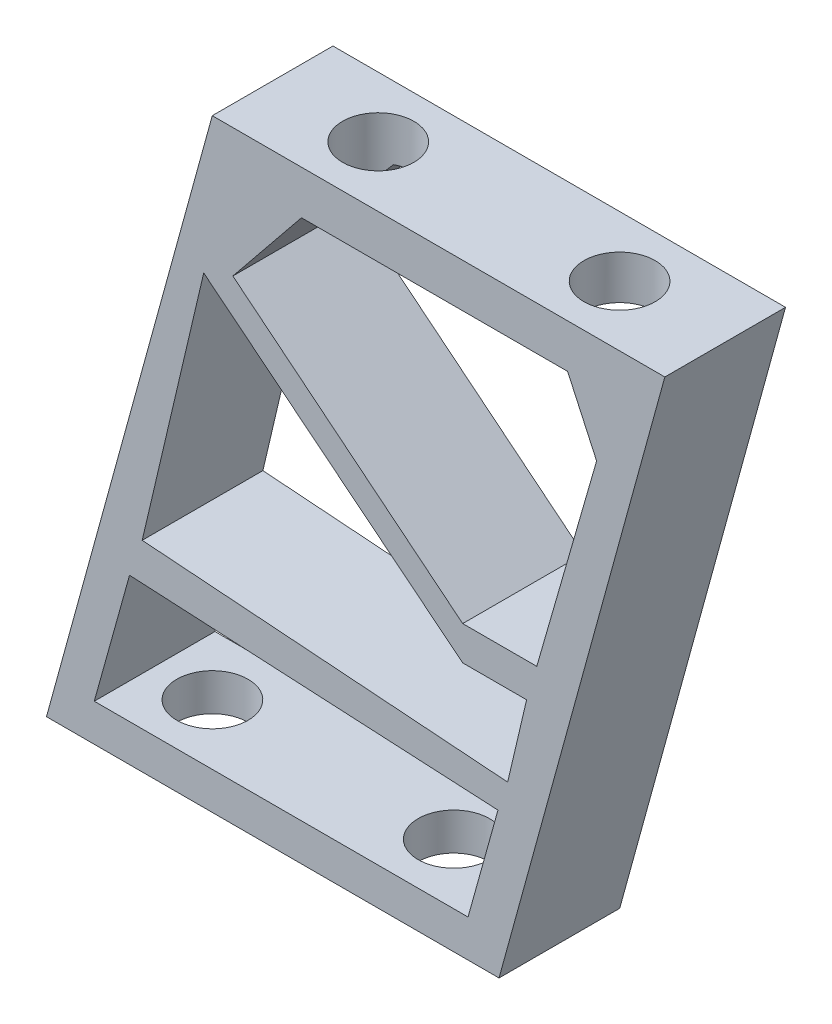
ISO-10303-21;
HEADER;
FILE_DESCRIPTION(('STEP AP214'),'2;1');
FILE_NAME('part.step','',(''),(''),'','','');
FILE_SCHEMA(('AUTOMOTIVE_DESIGN { 1 0 10303 214 1 1 1 1 }'));
ENDSEC;
DATA;
#1=APPLICATION_CONTEXT('core data for automotive mechanical design processes');
#2=APPLICATION_PROTOCOL_DEFINITION('international standard','automotive_design',2000,#1);
#3=PRODUCT_CONTEXT('',#1,'mechanical');
#4=PRODUCT('Part','Part','',(#3));
#5=PRODUCT_RELATED_PRODUCT_CATEGORY('part','',(#4));
#6=PRODUCT_DEFINITION_FORMATION('','',#4);
#7=PRODUCT_DEFINITION_CONTEXT('part definition',#1,'design');
#8=PRODUCT_DEFINITION('design','',#6,#7);
#9=PRODUCT_DEFINITION_SHAPE('','',#8);
#10=(LENGTH_UNIT() NAMED_UNIT(*) SI_UNIT(.MILLI.,.METRE.));
#11=(NAMED_UNIT(*) PLANE_ANGLE_UNIT() SI_UNIT($,.RADIAN.));
#12=(NAMED_UNIT(*) SI_UNIT($,.STERADIAN.) SOLID_ANGLE_UNIT());
#13=UNCERTAINTY_MEASURE_WITH_UNIT(LENGTH_MEASURE(1.E-05),#10,'distance_accuracy_value','');
#14=(GEOMETRIC_REPRESENTATION_CONTEXT(3) GLOBAL_UNCERTAINTY_ASSIGNED_CONTEXT((#13)) GLOBAL_UNIT_ASSIGNED_CONTEXT((#10,
#11,#12)) REPRESENTATION_CONTEXT('',''));
#15=CARTESIAN_POINT('',(0.,0.,0.));
#16=DIRECTION('',(0.,0.,1.));
#17=DIRECTION('',(1.,0.,0.));
#18=AXIS2_PLACEMENT_3D('',#15,#16,#17);
#19=CARTESIAN_POINT('',(-14.7335825545171,-18.5317133956386,5.08));
#20=DIRECTION('',(0.964262970192078,-0.264947021716328,0.));
#21=DIRECTION('',(0.264947021716328,0.964262970192078,0.));
#22=AXIS2_PLACEMENT_3D('',#19,#20,#21);
#23=PLANE('',#22);
#24=DIRECTION('',(-0.264947021716328,-0.964262970192078,0.));
#25=VECTOR('',#24,1.);
#26=CARTESIAN_POINT('',(-14.7335825545171,-18.5317133956386,0.));
#27=LINE('',#26,#25);
#28=CARTESIAN_POINT('',(-7.75451713395638,6.86828660436137,0.));
#29=VERTEX_POINT('',#28);
#30=CARTESIAN_POINT('',(-14.7335825545171,-18.5317133956386,0.));
#31=VERTEX_POINT('',#30);
#32=EDGE_CURVE('E327',#29,#31,#27,.T.);
#33=ORIENTED_EDGE('',*,*,#32,.T.);
#34=DIRECTION('',(0.,0.,-1.));
#35=VECTOR('',#34,1.);
#36=CARTESIAN_POINT('',(-14.7335825545171,-18.5317133956386,5.08));
#37=LINE('',#36,#35);
#38=CARTESIAN_POINT('',(-14.7335825545171,-18.5317133956386,5.08));
#39=VERTEX_POINT('',#38);
#40=EDGE_CURVE('E359',#39,#31,#37,.T.);
#41=ORIENTED_EDGE('',*,*,#40,.F.);
#42=DIRECTION('',(-0.264947021716328,-0.964262970192078,0.));
#43=VECTOR('',#42,1.);
#44=CARTESIAN_POINT('',(-14.7335825545171,-18.5317133956386,5.08));
#45=LINE('',#44,#43);
#46=CARTESIAN_POINT('',(-7.75451713395638,6.86828660436137,5.08));
#47=VERTEX_POINT('',#46);
#48=EDGE_CURVE('E333',#47,#39,#45,.T.);
#49=ORIENTED_EDGE('',*,*,#48,.F.);
#50=DIRECTION('',(0.,0.,-1.));
#51=VECTOR('',#50,1.);
#52=CARTESIAN_POINT('',(-7.75451713395638,6.86828660436137,5.08));
#53=LINE('',#52,#51);
#54=EDGE_CURVE('E343',#47,#29,#53,.T.);
#55=ORIENTED_EDGE('',*,*,#54,.T.);
#56=EDGE_LOOP('',(#33,#41,#49,#55));
#57=FACE_BOUND('',#56,.T.);
#58=ADVANCED_FACE('F38',(#57),#23,.F.);
#59=CARTESIAN_POINT('',(4.31641744548287,-18.5317133956386,5.08));
#60=DIRECTION('',(0.,1.,0.));
#61=DIRECTION('',(0.,0.,1.));
#62=AXIS2_PLACEMENT_3D('',#59,#60,#61);
#63=PLANE('',#62);
#64=CARTESIAN_POINT('',(-0.128582554517128,-18.5317133956386,2.54));
#65=DIRECTION('',(0.,-1.,0.));
#66=DIRECTION('',(0.,0.,-1.));
#67=AXIS2_PLACEMENT_3D('',#64,#65,#66);
#68=CIRCLE('',#67,1.5);
#69=CARTESIAN_POINT('',(-0.128582554517128,-18.5317133956386,1.04));
#70=VERTEX_POINT('',#69);
#71=EDGE_CURVE('E370',#70,#70,#68,.T.);
#72=ORIENTED_EDGE('',*,*,#71,.F.);
#73=EDGE_LOOP('',(#72));
#74=FACE_BOUND('',#73,.T.);
#75=CARTESIAN_POINT('',(-10.2885825545171,-18.5317133956386,2.54));
#76=DIRECTION('',(0.,-1.,0.));
#77=DIRECTION('',(0.,0.,-1.));
#78=AXIS2_PLACEMENT_3D('',#75,#76,#77);
#79=CIRCLE('',#78,1.5);
#80=CARTESIAN_POINT('',(-10.2885825545171,-18.5317133956386,1.04));
#81=VERTEX_POINT('',#80);
#82=EDGE_CURVE('E375',#81,#81,#79,.T.);
#83=ORIENTED_EDGE('',*,*,#82,.F.);
#84=EDGE_LOOP('',(#83));
#85=FACE_BOUND('',#84,.T.);
#86=DIRECTION('',(1.,0.,0.));
#87=VECTOR('',#86,1.);
#88=CARTESIAN_POINT('',(4.31641744548287,-18.5317133956386,0.));
#89=LINE('',#88,#87);
#90=CARTESIAN_POINT('',(4.31641744548287,-18.5317133956386,0.));
#91=VERTEX_POINT('',#90);
#92=EDGE_CURVE('E346',#31,#91,#89,.T.);
#93=ORIENTED_EDGE('',*,*,#92,.T.);
#94=DIRECTION('',(0.,0.,-1.));
#95=VECTOR('',#94,1.);
#96=CARTESIAN_POINT('',(4.31641744548287,-18.5317133956386,5.08));
#97=LINE('',#96,#95);
#98=CARTESIAN_POINT('',(4.31641744548287,-18.5317133956386,5.08));
#99=VERTEX_POINT('',#98);
#100=EDGE_CURVE('E356',#99,#91,#97,.T.);
#101=ORIENTED_EDGE('',*,*,#100,.F.);
#102=DIRECTION('',(1.,0.,0.));
#103=VECTOR('',#102,1.);
#104=CARTESIAN_POINT('',(4.31641744548287,-18.5317133956386,5.08));
#105=LINE('',#104,#103);
#106=EDGE_CURVE('E336',#39,#99,#105,.T.);
#107=ORIENTED_EDGE('',*,*,#106,.F.);
#108=ORIENTED_EDGE('',*,*,#40,.T.);
#109=EDGE_LOOP('',(#93,#101,#107,#108));
#110=FACE_BOUND('',#109,.T.);
#111=ADVANCED_FACE('F405',(#74,#85,#110),#63,.F.);
#112=CARTESIAN_POINT('',(11.2954828660436,6.86828660436136,5.08));
#113=DIRECTION('',(-0.964262970192078,0.264947021716328,0.));
#114=DIRECTION('',(-0.264947021716328,-0.964262970192078,0.));
#115=AXIS2_PLACEMENT_3D('',#112,#113,#114);
#116=PLANE('',#115);
#117=DIRECTION('',(0.264947021716328,0.964262970192078,0.));
#118=VECTOR('',#117,1.);
#119=CARTESIAN_POINT('',(11.2954828660436,6.86828660436136,0.));
#120=LINE('',#119,#118);
#121=CARTESIAN_POINT('',(11.2954828660436,6.86828660436136,0.));
#122=VERTEX_POINT('',#121);
#123=EDGE_CURVE('E348',#91,#122,#120,.T.);
#124=ORIENTED_EDGE('',*,*,#123,.T.);
#125=DIRECTION('',(0.,0.,-1.));
#126=VECTOR('',#125,1.);
#127=CARTESIAN_POINT('',(11.2954828660436,6.86828660436136,5.08));
#128=LINE('',#127,#126);
#129=CARTESIAN_POINT('',(11.2954828660436,6.86828660436136,5.08));
#130=VERTEX_POINT('',#129);
#131=EDGE_CURVE('E353',#130,#122,#128,.T.);
#132=ORIENTED_EDGE('',*,*,#131,.F.);
#133=DIRECTION('',(0.264947021716328,0.964262970192078,0.));
#134=VECTOR('',#133,1.);
#135=CARTESIAN_POINT('',(11.2954828660436,6.86828660436136,5.08));
#136=LINE('',#135,#134);
#137=EDGE_CURVE('E339',#99,#130,#136,.T.);
#138=ORIENTED_EDGE('',*,*,#137,.F.);
#139=ORIENTED_EDGE('',*,*,#100,.T.);
#140=EDGE_LOOP('',(#124,#132,#138,#139));
#141=FACE_BOUND('',#140,.T.);
#142=ADVANCED_FACE('F410',(#141),#116,.F.);
#143=CARTESIAN_POINT('',(-7.75451713395638,6.86828660436137,5.08));
#144=DIRECTION('',(0.,-1.,0.));
#145=DIRECTION('',(1.,0.,0.));
#146=AXIS2_PLACEMENT_3D('',#143,#144,#145);
#147=PLANE('',#146);
#148=CARTESIAN_POINT('',(6.85048286604362,6.86828660436137,2.54));
#149=DIRECTION('',(0.,1.,0.));
#150=DIRECTION('',(0.,0.,1.));
#151=AXIS2_PLACEMENT_3D('',#148,#149,#150);
#152=CIRCLE('',#151,1.5);
#153=CARTESIAN_POINT('',(6.85048286604362,6.86828660436137,4.04));
#154=VERTEX_POINT('',#153);
#155=EDGE_CURVE('E328',#154,#154,#152,.T.);
#156=ORIENTED_EDGE('',*,*,#155,.F.);
#157=EDGE_LOOP('',(#156));
#158=FACE_BOUND('',#157,.T.);
#159=CARTESIAN_POINT('',(-3.30951713395638,6.86828660436137,2.54));
#160=DIRECTION('',(0.,1.,0.));
#161=DIRECTION('',(0.,0.,1.));
#162=AXIS2_PLACEMENT_3D('',#159,#160,#161);
#163=CIRCLE('',#162,1.5);
#164=CARTESIAN_POINT('',(-3.30951713395638,6.86828660436137,4.04));
#165=VERTEX_POINT('',#164);
#166=EDGE_CURVE('E323',#165,#165,#163,.T.);
#167=ORIENTED_EDGE('',*,*,#166,.F.);
#168=EDGE_LOOP('',(#167));
#169=FACE_BOUND('',#168,.T.);
#170=DIRECTION('',(-1.,0.,0.));
#171=VECTOR('',#170,1.);
#172=CARTESIAN_POINT('',(-7.75451713395638,6.86828660436137,0.));
#173=LINE('',#172,#171);
#174=EDGE_CURVE('E337',#122,#29,#173,.T.);
#175=ORIENTED_EDGE('',*,*,#174,.T.);
#176=ORIENTED_EDGE('',*,*,#54,.F.);
#177=DIRECTION('',(-1.,0.,0.));
#178=VECTOR('',#177,1.);
#179=CARTESIAN_POINT('',(-7.75451713395638,6.86828660436137,5.08));
#180=LINE('',#179,#178);
#181=EDGE_CURVE('E341',#130,#47,#180,.T.);
#182=ORIENTED_EDGE('',*,*,#181,.F.);
#183=ORIENTED_EDGE('',*,*,#131,.T.);
#184=EDGE_LOOP('',(#175,#176,#182,#183));
#185=FACE_BOUND('',#184,.T.);
#186=ADVANCED_FACE('F393',(#158,#169,#185),#147,.F.);
#187=CARTESIAN_POINT('',(0.,0.,5.08));
#188=DIRECTION('',(0.,0.,-1.));
#189=DIRECTION('',(-1.,0.,0.));
#190=AXIS2_PLACEMENT_3D('',#187,#188,#189);
#191=PLANE('',#190);
#192=DIRECTION('',(0.268017444999017,0.96341405905052,0.));
#193=VECTOR('',#192,1.);
#194=CARTESIAN_POINT('',(-7.42840967186298,2.0665500590897,5.08));
#195=LINE('',#194,#193);
#196=CARTESIAN_POINT('',(-12.7218358869841,-16.9611712006699,5.08));
#197=VERTEX_POINT('',#196);
#198=CARTESIAN_POINT('',(-11.2373063223956,-11.6248892522841,5.08));
#199=VERTEX_POINT('',#198);
#200=EDGE_CURVE('E317',#197,#199,#195,.T.);
#201=ORIENTED_EDGE('',*,*,#200,.T.);
#202=DIRECTION('',(0.998640082945662,-0.0521342951835177,0.));
#203=VECTOR('',#202,1.);
#204=CARTESIAN_POINT('',(-0.635774049708128,-12.1783453195307,5.08));
#205=LINE('',#204,#203);
#206=CARTESIAN_POINT('',(4.27111704776784,-12.4345109925073,5.08));
#207=VERTEX_POINT('',#206);
#208=EDGE_CURVE('E320',#199,#207,#205,.T.);
#209=ORIENTED_EDGE('',*,*,#208,.T.);
#210=DIRECTION('',(-0.268017444999017,-0.96341405905052,0.));
#211=VECTOR('',#210,1.);
#212=CARTESIAN_POINT('',(7.17504554791132,-1.9960653028024,5.08));
#213=LINE('',#212,#211);
#214=CARTESIAN_POINT('',(3.01182059888051,-16.9611712006699,5.08));
#215=VERTEX_POINT('',#214);
#216=EDGE_CURVE('E311',#207,#215,#213,.T.);
#217=ORIENTED_EDGE('',*,*,#216,.T.);
#218=DIRECTION('',(-1.,0.,0.));
#219=VECTOR('',#218,1.);
#220=CARTESIAN_POINT('',(0.,-16.9611712006699,5.08));
#221=LINE('',#220,#219);
#222=EDGE_CURVE('E314',#215,#197,#221,.T.);
#223=ORIENTED_EDGE('',*,*,#222,.T.);
#224=EDGE_LOOP('',(#201,#209,#217,#223));
#225=FACE_BOUND('',#224,.T.);
#226=DIRECTION('',(0.228290771681176,0.973592996875601,0.));
#227=VECTOR('',#226,1.);
#228=CARTESIAN_POINT('',(-7.90466937511239,1.85350868106084,5.08));
#229=LINE('',#228,#227);
#230=CARTESIAN_POINT('',(-10.7043001822436,-10.0860932905282,5.08));
#231=VERTEX_POINT('',#230);
#232=CARTESIAN_POINT('',(-8.11511502540993,0.95601987832134,5.08));
#233=VERTEX_POINT('',#232);
#234=EDGE_CURVE('E305',#231,#233,#229,.T.);
#235=ORIENTED_EDGE('',*,*,#234,.T.);
#236=DIRECTION('',(0.779324811366926,-0.626620170747723,0.));
#237=VECTOR('',#236,1.);
#238=CARTESIAN_POINT('',(-2.71955958325272,-3.38230455730544,5.08));
#239=LINE('',#238,#237);
#240=CARTESIAN_POINT('',(2.78607256570793,-7.80913674195606,5.08));
#241=VERTEX_POINT('',#240);
#242=EDGE_CURVE('E308',#233,#241,#239,.T.);
#243=ORIENTED_EDGE('',*,*,#242,.T.);
#244=DIRECTION('',(1.,0.,0.));
#245=VECTOR('',#244,1.);
#246=CARTESIAN_POINT('',(0.,-7.80913674195606,5.08));
#247=LINE('',#246,#245);
#248=CARTESIAN_POINT('',(5.47680535621506,-7.80913674195606,5.08));
#249=VERTEX_POINT('',#248);
#250=EDGE_CURVE('E299',#241,#249,#247,.T.);
#251=ORIENTED_EDGE('',*,*,#250,.T.);
#252=DIRECTION('',(-0.228290771681176,-0.973592996875601,0.));
#253=VECTOR('',#252,1.);
#254=CARTESIAN_POINT('',(6.92704912998805,-1.62427358910065,5.08));
#255=LINE('',#254,#253);
#256=CARTESIAN_POINT('',(4.67953751767725,-11.2092495827791,5.08));
#257=VERTEX_POINT('',#256);
#258=EDGE_CURVE('E193',#249,#257,#255,.T.);
#259=ORIENTED_EDGE('',*,*,#258,.T.);
#260=DIRECTION('',(-0.997345461341722,0.0728150447439755,0.));
#261=VECTOR('',#260,1.);
#262=CARTESIAN_POINT('',(-0.789224318355459,-10.8099815726263,5.08));
#263=LINE('',#262,#261);
#264=EDGE_CURVE('E302',#257,#231,#263,.T.);
#265=ORIENTED_EDGE('',*,*,#264,.T.);
#266=EDGE_LOOP('',(#235,#243,#251,#259,#265));
#267=FACE_BOUND('',#266,.T.);
#268=DIRECTION('',(0.629179252222636,0.777260232208341,0.));
#269=VECTOR('',#268,1.);
#270=CARTESIAN_POINT('',(-4.87380278290498,3.94526242738069,5.08));
#271=LINE('',#270,#269);
#272=CARTESIAN_POINT('',(-6.88911751722157,1.45563170158313,5.08));
#273=VERTEX_POINT('',#272);
#274=CARTESIAN_POINT('',(-3.99939746789758,5.0254640961197,5.08));
#275=VERTEX_POINT('',#274);
#276=EDGE_CURVE('E290',#273,#275,#271,.T.);
#277=ORIENTED_EDGE('',*,*,#276,.T.);
#278=DIRECTION('',(1.,0.,0.));
#279=VECTOR('',#278,1.);
#280=CARTESIAN_POINT('',(0.,5.0254640961197,5.08));
#281=LINE('',#280,#279);
#282=CARTESIAN_POINT('',(7.20364961099122,5.0254640961197,5.08));
#283=VERTEX_POINT('',#282);
#284=EDGE_CURVE('E287',#275,#283,#281,.T.);
#285=ORIENTED_EDGE('',*,*,#284,.T.);
#286=DIRECTION('',(0.417500171550712,-0.908676843963313,0.));
#287=VECTOR('',#286,1.);
#288=CARTESIAN_POINT('',(7.85453150416542,3.60883879921114,5.08));
#289=LINE('',#288,#287);
#290=CARTESIAN_POINT('',(8.42339182518011,2.37073104170858,5.08));
#291=VERTEX_POINT('',#290);
#292=EDGE_CURVE('E281',#283,#291,#289,.T.);
#293=ORIENTED_EDGE('',*,*,#292,.T.);
#294=DIRECTION('',(-0.276695939854151,-0.960957520844823,0.));
#295=VECTOR('',#294,1.);
#296=CARTESIAN_POINT('',(7.14813063558347,-2.05821660324193,5.08));
#297=LINE('',#296,#295);
#298=CARTESIAN_POINT('',(5.90479892740546,-6.37627402218448,5.08));
#299=VERTEX_POINT('',#298);
#300=EDGE_CURVE('E278',#291,#299,#297,.T.);
#301=ORIENTED_EDGE('',*,*,#300,.T.);
#302=DIRECTION('',(-1.,0.,0.));
#303=VECTOR('',#302,1.);
#304=CARTESIAN_POINT('',(0.,-6.37627402218448,5.08));
#305=LINE('',#304,#303);
#306=CARTESIAN_POINT('',(2.78607256570793,-6.37627402218448,5.08));
#307=VERTEX_POINT('',#306);
#308=EDGE_CURVE('E293',#299,#307,#305,.T.);
#309=ORIENTED_EDGE('',*,*,#308,.T.);
#310=DIRECTION('',(-0.777260232208341,0.629179252222636,0.));
#311=VECTOR('',#310,1.);
#312=CARTESIAN_POINT('',(-2.01531473431659,-2.48963072579756,5.08));
#313=LINE('',#312,#311);
#314=EDGE_CURVE('E296',#307,#273,#313,.T.);
#315=ORIENTED_EDGE('',*,*,#314,.T.);
#316=EDGE_LOOP('',(#277,#285,#293,#301,#309,#315));
#317=FACE_BOUND('',#316,.T.);
#318=ORIENTED_EDGE('',*,*,#48,.T.);
#319=ORIENTED_EDGE('',*,*,#106,.T.);
#320=ORIENTED_EDGE('',*,*,#137,.T.);
#321=ORIENTED_EDGE('',*,*,#181,.T.);
#322=EDGE_LOOP('',(#318,#319,#320,#321));
#323=FACE_BOUND('',#322,.T.);
#324=ADVANCED_FACE('F390',(#225,#267,#317,#323),#191,.F.);
#325=CARTESIAN_POINT('',(0.,0.,0.));
#326=DIRECTION('',(0.,0.,-1.));
#327=DIRECTION('',(-1.,0.,0.));
#328=AXIS2_PLACEMENT_3D('',#325,#326,#327);
#329=PLANE('',#328);
#330=DIRECTION('',(0.998640082945662,-0.0521342951835177,0.));
#331=VECTOR('',#330,1.);
#332=CARTESIAN_POINT('',(-11.2373063223956,-11.6248892522841,0.));
#333=LINE('',#332,#331);
#334=CARTESIAN_POINT('',(-11.2373063223956,-11.6248892522841,0.));
#335=VERTEX_POINT('',#334);
#336=CARTESIAN_POINT('',(4.27111704776785,-12.4345109925073,0.));
#337=VERTEX_POINT('',#336);
#338=EDGE_CURVE('E226',#335,#337,#333,.T.);
#339=ORIENTED_EDGE('',*,*,#338,.F.);
#340=DIRECTION('',(0.268017444999017,0.96341405905052,0.));
#341=VECTOR('',#340,1.);
#342=CARTESIAN_POINT('',(-12.7218358869841,-16.9611712006699,0.));
#343=LINE('',#342,#341);
#344=CARTESIAN_POINT('',(-12.7218358869841,-16.9611712006699,0.));
#345=VERTEX_POINT('',#344);
#346=EDGE_CURVE('E233',#345,#335,#343,.T.);
#347=ORIENTED_EDGE('',*,*,#346,.F.);
#348=DIRECTION('',(-1.,0.,0.));
#349=VECTOR('',#348,1.);
#350=CARTESIAN_POINT('',(3.01182059888051,-16.9611712006699,0.));
#351=LINE('',#350,#349);
#352=CARTESIAN_POINT('',(3.01182059888051,-16.9611712006699,0.));
#353=VERTEX_POINT('',#352);
#354=EDGE_CURVE('E230',#353,#345,#351,.T.);
#355=ORIENTED_EDGE('',*,*,#354,.F.);
#356=DIRECTION('',(-0.268017444999017,-0.96341405905052,0.));
#357=VECTOR('',#356,1.);
#358=CARTESIAN_POINT('',(4.27111704776784,-12.4345109925073,0.));
#359=LINE('',#358,#357);
#360=EDGE_CURVE('E228',#337,#353,#359,.T.);
#361=ORIENTED_EDGE('',*,*,#360,.F.);
#362=EDGE_LOOP('',(#339,#347,#355,#361));
#363=FACE_BOUND('',#362,.T.);
#364=DIRECTION('',(0.779324811366925,-0.626620170747723,0.));
#365=VECTOR('',#364,1.);
#366=CARTESIAN_POINT('',(2.78607256570793,-7.80913674195606,0.));
#367=LINE('',#366,#365);
#368=CARTESIAN_POINT('',(-8.11511502540993,0.95601987832134,0.));
#369=VERTEX_POINT('',#368);
#370=CARTESIAN_POINT('',(2.78607256570793,-7.80913674195606,0.));
#371=VERTEX_POINT('',#370);
#372=EDGE_CURVE('E205',#369,#371,#367,.T.);
#373=ORIENTED_EDGE('',*,*,#372,.F.);
#374=DIRECTION('',(0.228290771681175,0.973592996875601,0.));
#375=VECTOR('',#374,1.);
#376=CARTESIAN_POINT('',(-8.11511502540993,0.95601987832134,0.));
#377=LINE('',#376,#375);
#378=CARTESIAN_POINT('',(-10.7043001822436,-10.0860932905282,0.));
#379=VERTEX_POINT('',#378);
#380=EDGE_CURVE('E213',#379,#369,#377,.T.);
#381=ORIENTED_EDGE('',*,*,#380,.F.);
#382=DIRECTION('',(-0.997345461341722,0.0728150447439754,0.));
#383=VECTOR('',#382,1.);
#384=CARTESIAN_POINT('',(-10.7043001822436,-10.0860932905282,0.));
#385=LINE('',#384,#383);
#386=CARTESIAN_POINT('',(4.67953751767725,-11.2092495827791,0.));
#387=VERTEX_POINT('',#386);
#388=EDGE_CURVE('E211',#387,#379,#385,.T.);
#389=ORIENTED_EDGE('',*,*,#388,.F.);
#390=DIRECTION('',(-0.228290771681176,-0.973592996875601,0.));
#391=VECTOR('',#390,1.);
#392=CARTESIAN_POINT('',(4.67953751767725,-11.2092495827791,0.));
#393=LINE('',#392,#391);
#394=CARTESIAN_POINT('',(5.47680535621506,-7.80913674195606,0.));
#395=VERTEX_POINT('',#394);
#396=EDGE_CURVE('E190',#395,#387,#393,.T.);
#397=ORIENTED_EDGE('',*,*,#396,.F.);
#398=DIRECTION('',(1.,0.,0.));
#399=VECTOR('',#398,1.);
#400=CARTESIAN_POINT('',(5.47680535621506,-7.80913674195606,0.));
#401=LINE('',#400,#399);
#402=EDGE_CURVE('E200',#371,#395,#401,.T.);
#403=ORIENTED_EDGE('',*,*,#402,.F.);
#404=EDGE_LOOP('',(#373,#381,#389,#397,#403));
#405=FACE_BOUND('',#404,.T.);
#406=DIRECTION('',(1.,0.,0.));
#407=VECTOR('',#406,1.);
#408=CARTESIAN_POINT('',(-3.99939746789758,5.0254640961197,0.));
#409=LINE('',#408,#407);
#410=CARTESIAN_POINT('',(-3.99939746789758,5.0254640961197,0.));
#411=VERTEX_POINT('',#410);
#412=CARTESIAN_POINT('',(7.20364961099122,5.0254640961197,0.));
#413=VERTEX_POINT('',#412);
#414=EDGE_CURVE('E221',#411,#413,#409,.T.);
#415=ORIENTED_EDGE('',*,*,#414,.F.);
#416=DIRECTION('',(0.629179252222636,0.777260232208341,0.));
#417=VECTOR('',#416,1.);
#418=CARTESIAN_POINT('',(-6.88911751722157,1.45563170158313,0.));
#419=LINE('',#418,#417);
#420=CARTESIAN_POINT('',(-6.88911751722157,1.45563170158313,0.));
#421=VERTEX_POINT('',#420);
#422=EDGE_CURVE('E257',#421,#411,#419,.T.);
#423=ORIENTED_EDGE('',*,*,#422,.F.);
#424=DIRECTION('',(-0.777260232208341,0.629179252222636,0.));
#425=VECTOR('',#424,1.);
#426=CARTESIAN_POINT('',(2.78607256570793,-6.37627402218448,0.));
#427=LINE('',#426,#425);
#428=CARTESIAN_POINT('',(2.78607256570793,-6.37627402218448,0.));
#429=VERTEX_POINT('',#428);
#430=EDGE_CURVE('E254',#429,#421,#427,.T.);
#431=ORIENTED_EDGE('',*,*,#430,.F.);
#432=DIRECTION('',(-1.,0.,0.));
#433=VECTOR('',#432,1.);
#434=CARTESIAN_POINT('',(5.90479892740546,-6.37627402218448,0.));
#435=LINE('',#434,#433);
#436=CARTESIAN_POINT('',(5.90479892740546,-6.37627402218448,0.));
#437=VERTEX_POINT('',#436);
#438=EDGE_CURVE('E251',#437,#429,#435,.T.);
#439=ORIENTED_EDGE('',*,*,#438,.F.);
#440=DIRECTION('',(-0.276695939854151,-0.960957520844823,0.));
#441=VECTOR('',#440,1.);
#442=CARTESIAN_POINT('',(8.42339182518011,2.37073104170858,0.));
#443=LINE('',#442,#441);
#444=CARTESIAN_POINT('',(8.42339182518011,2.37073104170858,0.));
#445=VERTEX_POINT('',#444);
#446=EDGE_CURVE('E248',#445,#437,#443,.T.);
#447=ORIENTED_EDGE('',*,*,#446,.F.);
#448=DIRECTION('',(0.417500171550712,-0.908676843963312,0.));
#449=VECTOR('',#448,1.);
#450=CARTESIAN_POINT('',(7.20364961099122,5.0254640961197,0.));
#451=LINE('',#450,#449);
#452=EDGE_CURVE('E245',#413,#445,#451,.T.);
#453=ORIENTED_EDGE('',*,*,#452,.F.);
#454=EDGE_LOOP('',(#415,#423,#431,#439,#447,#453));
#455=FACE_BOUND('',#454,.T.);
#456=ORIENTED_EDGE('',*,*,#32,.F.);
#457=ORIENTED_EDGE('',*,*,#174,.F.);
#458=ORIENTED_EDGE('',*,*,#123,.F.);
#459=ORIENTED_EDGE('',*,*,#92,.F.);
#460=EDGE_LOOP('',(#456,#457,#458,#459));
#461=FACE_BOUND('',#460,.T.);
#462=ADVANCED_FACE('F207',(#363,#405,#455,#461),#329,.T.);
#463=CARTESIAN_POINT('',(-3.30951713395638,1.78828660436137,2.54));
#464=DIRECTION('',(0.,1.,0.));
#465=DIRECTION('',(0.,0.,1.));
#466=AXIS2_PLACEMENT_3D('',#463,#464,#465);
#467=CYLINDRICAL_SURFACE('',#466,1.5);
#468=CARTESIAN_POINT('',(-3.30951713395638,5.87771176109096,2.54));
#469=DIRECTION('',(-0.777260232208341,0.629179252222636,0.));
#470=DIRECTION('',(0.629179252222636,0.777260232208341,0.));
#471=AXIS2_PLACEMENT_3D('',#468,#469,#470);
#472=ELLIPSE('',#471,2.3840582706774,1.5);
#473=CARTESIAN_POINT('',(-3.99939746789758,5.0254640961197,3.87194036084248));
#474=VERTEX_POINT('',#473);
#475=CARTESIAN_POINT('',(-3.99939746789758,5.0254640961197,1.20805963915753));
#476=VERTEX_POINT('',#475);
#477=EDGE_CURVE('E11',#474,#476,#472,.F.);
#478=ORIENTED_EDGE('',*,*,#477,.T.);
#479=CARTESIAN_POINT('',(-3.30951713395638,5.0254640961197,2.54));
#480=DIRECTION('',(0.,1.,0.));
#481=DIRECTION('',(-1.,0.,0.));
#482=AXIS2_PLACEMENT_3D('',#479,#480,#481);
#483=CIRCLE('',#482,1.5);
#484=EDGE_CURVE('E284',#476,#474,#483,.F.);
#485=ORIENTED_EDGE('',*,*,#484,.T.);
#486=EDGE_LOOP('',(#478,#485));
#487=FACE_BOUND('',#486,.T.);
#488=ORIENTED_EDGE('',*,*,#166,.T.);
#489=EDGE_LOOP('',(#488));
#490=FACE_BOUND('',#489,.T.);
#491=ADVANCED_FACE('F415',(#487,#490),#467,.F.);
#492=CARTESIAN_POINT('',(6.85048286604362,1.78828660436137,2.54));
#493=DIRECTION('',(0.,1.,0.));
#494=DIRECTION('',(0.,0.,1.));
#495=AXIS2_PLACEMENT_3D('',#492,#493,#494);
#496=CYLINDRICAL_SURFACE('',#495,1.5);
#497=CARTESIAN_POINT('',(6.85048286604362,5.79412112924096,2.54));
#498=DIRECTION('',(0.908676843963313,0.417500171550712,0.));
#499=DIRECTION('',(-0.417500171550712,0.908676843963313,0.));
#500=AXIS2_PLACEMENT_3D('',#497,#498,#499);
#501=ELLIPSE('',#500,3.592812894971,1.5);
#502=CARTESIAN_POINT('',(7.20364961099122,5.0254640961197,1.08216830523441));
#503=VERTEX_POINT('',#502);
#504=CARTESIAN_POINT('',(7.20364961099122,5.0254640961197,3.99783169476559));
#505=VERTEX_POINT('',#504);
#506=EDGE_CURVE('E364',#503,#505,#501,.F.);
#507=ORIENTED_EDGE('',*,*,#506,.T.);
#508=CARTESIAN_POINT('',(6.85048286604362,5.0254640961197,2.54));
#509=DIRECTION('',(0.,1.,0.));
#510=DIRECTION('',(-1.,0.,0.));
#511=AXIS2_PLACEMENT_3D('',#508,#509,#510);
#512=CIRCLE('',#511,1.5);
#513=EDGE_CURVE('E46',#505,#503,#512,.F.);
#514=ORIENTED_EDGE('',*,*,#513,.T.);
#515=EDGE_LOOP('',(#507,#514));
#516=FACE_BOUND('',#515,.T.);
#517=ORIENTED_EDGE('',*,*,#155,.T.);
#518=EDGE_LOOP('',(#517));
#519=FACE_BOUND('',#518,.T.);
#520=ADVANCED_FACE('F421',(#516,#519),#496,.F.);
#521=CARTESIAN_POINT('',(2.78607256570793,-6.37627402218448,7.62));
#522=DIRECTION('',(-0.629179252222636,-0.777260232208341,0.));
#523=DIRECTION('',(0.777260232208341,-0.629179252222636,0.));
#524=AXIS2_PLACEMENT_3D('',#521,#522,#523);
#525=PLANE('',#524);
#526=DIRECTION('',(0.,0.,-1.));
#527=VECTOR('',#526,1.);
#528=CARTESIAN_POINT('',(2.78607256570793,-6.37627402218448,7.62));
#529=LINE('',#528,#527);
#530=EDGE_CURVE('E266',#307,#429,#529,.T.);
#531=ORIENTED_EDGE('',*,*,#530,.T.);
#532=ORIENTED_EDGE('',*,*,#430,.T.);
#533=DIRECTION('',(0.,0.,-1.));
#534=VECTOR('',#533,1.);
#535=CARTESIAN_POINT('',(-6.88911751722157,1.45563170158313,7.62));
#536=LINE('',#535,#534);
#537=EDGE_CURVE('E264',#273,#421,#536,.T.);
#538=ORIENTED_EDGE('',*,*,#537,.F.);
#539=ORIENTED_EDGE('',*,*,#314,.F.);
#540=EDGE_LOOP('',(#531,#532,#538,#539));
#541=FACE_BOUND('',#540,.T.);
#542=ADVANCED_FACE('F446',(#541),#525,.F.);
#543=CARTESIAN_POINT('',(5.90479892740546,-6.37627402218448,7.62));
#544=DIRECTION('',(0.,-1.,0.));
#545=DIRECTION('',(0.,0.,-1.));
#546=AXIS2_PLACEMENT_3D('',#543,#544,#545);
#547=PLANE('',#546);
#548=DIRECTION('',(0.,0.,-1.));
#549=VECTOR('',#548,1.);
#550=CARTESIAN_POINT('',(5.90479892740546,-6.37627402218448,7.62));
#551=LINE('',#550,#549);
#552=EDGE_CURVE('E268',#299,#437,#551,.T.);
#553=ORIENTED_EDGE('',*,*,#552,.T.);
#554=ORIENTED_EDGE('',*,*,#438,.T.);
#555=ORIENTED_EDGE('',*,*,#530,.F.);
#556=ORIENTED_EDGE('',*,*,#308,.F.);
#557=EDGE_LOOP('',(#553,#554,#555,#556));
#558=FACE_BOUND('',#557,.T.);
#559=ADVANCED_FACE('F453',(#558),#547,.F.);
#560=CARTESIAN_POINT('',(-6.88911751722157,1.45563170158313,7.62));
#561=DIRECTION('',(-0.777260232208341,0.629179252222636,0.));
#562=DIRECTION('',(-0.629179252222636,-0.777260232208341,0.));
#563=AXIS2_PLACEMENT_3D('',#560,#561,#562);
#564=PLANE('',#563);
#565=ORIENTED_EDGE('',*,*,#537,.T.);
#566=ORIENTED_EDGE('',*,*,#422,.T.);
#567=DIRECTION('',(0.,0.,-1.));
#568=VECTOR('',#567,1.);
#569=CARTESIAN_POINT('',(-3.99939746789758,5.0254640961197,7.62));
#570=LINE('',#569,#568);
#571=EDGE_CURVE('E261',#476,#411,#570,.T.);
#572=ORIENTED_EDGE('',*,*,#571,.F.);
#573=ORIENTED_EDGE('',*,*,#477,.F.);
#574=EDGE_CURVE('E263',#275,#474,#570,.T.);
#575=ORIENTED_EDGE('',*,*,#574,.F.);
#576=ORIENTED_EDGE('',*,*,#276,.F.);
#577=EDGE_LOOP('',(#565,#566,#572,#573,#575,#576));
#578=FACE_BOUND('',#577,.T.);
#579=ADVANCED_FACE('F498',(#578),#564,.F.);
#580=CARTESIAN_POINT('',(-3.99939746789758,5.0254640961197,7.62));
#581=DIRECTION('',(0.,1.,0.));
#582=DIRECTION('',(-1.,0.,0.));
#583=AXIS2_PLACEMENT_3D('',#580,#581,#582);
#584=PLANE('',#583);
#585=ORIENTED_EDGE('',*,*,#574,.T.);
#586=ORIENTED_EDGE('',*,*,#484,.F.);
#587=ORIENTED_EDGE('',*,*,#571,.T.);
#588=ORIENTED_EDGE('',*,*,#414,.T.);
#589=DIRECTION('',(0.,0.,-1.));
#590=VECTOR('',#589,1.);
#591=CARTESIAN_POINT('',(7.20364961099122,5.0254640961197,7.62));
#592=LINE('',#591,#590);
#593=EDGE_CURVE('E260',#503,#413,#592,.T.);
#594=ORIENTED_EDGE('',*,*,#593,.F.);
#595=ORIENTED_EDGE('',*,*,#513,.F.);
#596=EDGE_CURVE('E272',#283,#505,#592,.T.);
#597=ORIENTED_EDGE('',*,*,#596,.F.);
#598=ORIENTED_EDGE('',*,*,#284,.F.);
#599=EDGE_LOOP('',(#585,#586,#587,#588,#594,#595,#597,#598));
#600=FACE_BOUND('',#599,.T.);
#601=ADVANCED_FACE('F494',(#600),#584,.F.);
#602=CARTESIAN_POINT('',(7.20364961099122,5.0254640961197,7.62));
#603=DIRECTION('',(0.908676843963313,0.417500171550712,0.));
#604=DIRECTION('',(-0.417500171550712,0.908676843963313,0.));
#605=AXIS2_PLACEMENT_3D('',#602,#603,#604);
#606=PLANE('',#605);
#607=ORIENTED_EDGE('',*,*,#596,.T.);
#608=ORIENTED_EDGE('',*,*,#506,.F.);
#609=ORIENTED_EDGE('',*,*,#593,.T.);
#610=ORIENTED_EDGE('',*,*,#452,.T.);
#611=DIRECTION('',(0.,0.,-1.));
#612=VECTOR('',#611,1.);
#613=CARTESIAN_POINT('',(8.42339182518011,2.37073104170858,7.62));
#614=LINE('',#613,#612);
#615=EDGE_CURVE('E270',#291,#445,#614,.T.);
#616=ORIENTED_EDGE('',*,*,#615,.F.);
#617=ORIENTED_EDGE('',*,*,#292,.F.);
#618=EDGE_LOOP('',(#607,#608,#609,#610,#616,#617));
#619=FACE_BOUND('',#618,.T.);
#620=ADVANCED_FACE('F476',(#619),#606,.F.);
#621=CARTESIAN_POINT('',(8.42339182518011,2.37073104170858,7.62));
#622=DIRECTION('',(0.960957520844823,-0.276695939854151,0.));
#623=DIRECTION('',(0.276695939854151,0.960957520844823,0.));
#624=AXIS2_PLACEMENT_3D('',#621,#622,#623);
#625=PLANE('',#624);
#626=DIRECTION('',(0.,0.,-1.));
#627=VECTOR('',#626,1.);
#628=CARTESIAN_POINT('',(8.2556840883564,1.78828660436137,2.54));
#629=LINE('',#628,#627);
#630=CARTESIAN_POINT('',(8.2556840883564,1.78828660436137,3.06479474541067));
#631=VERTEX_POINT('',#630);
#632=CARTESIAN_POINT('',(8.2556840883564,1.78828660436137,2.01520525458933));
#633=VERTEX_POINT('',#632);
#634=EDGE_CURVE('E362',#631,#633,#629,.T.);
#635=ORIENTED_EDGE('',*,*,#634,.T.);
#636=CARTESIAN_POINT('',(6.85048286604362,-3.09193926231953,2.54));
#637=DIRECTION('',(0.960957520844823,-0.276695939854151,0.));
#638=DIRECTION('',(0.276695939854151,0.960957520844823,0.));
#639=AXIS2_PLACEMENT_3D('',#636,#637,#638);
#640=ELLIPSE('',#639,5.421113156885,1.5);
#641=EDGE_CURVE('E275',#631,#633,#640,.F.);
#642=ORIENTED_EDGE('',*,*,#641,.F.);
#643=EDGE_LOOP('',(#635,#642));
#644=FACE_BOUND('',#643,.T.);
#645=ORIENTED_EDGE('',*,*,#615,.T.);
#646=ORIENTED_EDGE('',*,*,#446,.T.);
#647=ORIENTED_EDGE('',*,*,#552,.F.);
#648=ORIENTED_EDGE('',*,*,#300,.F.);
#649=EDGE_LOOP('',(#645,#646,#647,#648));
#650=FACE_BOUND('',#649,.T.);
#651=ADVANCED_FACE('F473',(#644,#650),#625,.F.);
#652=CARTESIAN_POINT('',(2.78607256570793,-7.80913674195606,7.62));
#653=DIRECTION('',(0.626620170747723,0.779324811366925,0.));
#654=DIRECTION('',(-0.779324811366926,0.626620170747723,0.));
#655=AXIS2_PLACEMENT_3D('',#652,#653,#654);
#656=PLANE('',#655);
#657=DIRECTION('',(0.,0.,-1.));
#658=VECTOR('',#657,1.);
#659=CARTESIAN_POINT('',(-8.11511502540993,0.95601987832134,7.62));
#660=LINE('',#659,#658);
#661=EDGE_CURVE('E219',#233,#369,#660,.T.);
#662=ORIENTED_EDGE('',*,*,#661,.T.);
#663=ORIENTED_EDGE('',*,*,#372,.T.);
#664=DIRECTION('',(0.,0.,-1.));
#665=VECTOR('',#664,1.);
#666=CARTESIAN_POINT('',(2.78607256570793,-7.80913674195606,7.62));
#667=LINE('',#666,#665);
#668=EDGE_CURVE('E196',#241,#371,#667,.T.);
#669=ORIENTED_EDGE('',*,*,#668,.F.);
#670=ORIENTED_EDGE('',*,*,#242,.F.);
#671=EDGE_LOOP('',(#662,#663,#669,#670));
#672=FACE_BOUND('',#671,.T.);
#673=ADVANCED_FACE('F382',(#672),#656,.F.);
#674=CARTESIAN_POINT('',(-8.11511502540993,0.95601987832134,7.62));
#675=DIRECTION('',(-0.973592996875601,0.228290771681175,0.));
#676=DIRECTION('',(-0.228290771681176,-0.973592996875601,0.));
#677=AXIS2_PLACEMENT_3D('',#674,#675,#676);
#678=PLANE('',#677);
#679=DIRECTION('',(0.,0.,-1.));
#680=VECTOR('',#679,1.);
#681=CARTESIAN_POINT('',(-10.7043001822436,-10.0860932905282,7.62));
#682=LINE('',#681,#680);
#683=EDGE_CURVE('E222',#231,#379,#682,.T.);
#684=ORIENTED_EDGE('',*,*,#683,.T.);
#685=ORIENTED_EDGE('',*,*,#380,.T.);
#686=ORIENTED_EDGE('',*,*,#661,.F.);
#687=ORIENTED_EDGE('',*,*,#234,.F.);
#688=EDGE_LOOP('',(#684,#685,#686,#687));
#689=FACE_BOUND('',#688,.T.);
#690=ADVANCED_FACE('F385',(#689),#678,.F.);
#691=CARTESIAN_POINT('',(-10.7043001822436,-10.0860932905282,7.62));
#692=DIRECTION('',(-0.0728150447439754,-0.997345461341722,0.));
#693=DIRECTION('',(0.997345461341722,-0.0728150447439755,0.));
#694=AXIS2_PLACEMENT_3D('',#691,#692,#693);
#695=PLANE('',#694);
#696=DIRECTION('',(0.,0.,-1.));
#697=VECTOR('',#696,1.);
#698=CARTESIAN_POINT('',(4.67953751767725,-11.2092495827791,7.62));
#699=LINE('',#698,#697);
#700=EDGE_CURVE('E195',#257,#387,#699,.T.);
#701=ORIENTED_EDGE('',*,*,#700,.T.);
#702=ORIENTED_EDGE('',*,*,#388,.T.);
#703=ORIENTED_EDGE('',*,*,#683,.F.);
#704=ORIENTED_EDGE('',*,*,#264,.F.);
#705=EDGE_LOOP('',(#701,#702,#703,#704));
#706=FACE_BOUND('',#705,.T.);
#707=ADVANCED_FACE('F388',(#706),#695,.F.);
#708=CARTESIAN_POINT('',(4.67953751767725,-11.2092495827791,7.62));
#709=DIRECTION('',(0.973592996875601,-0.228290771681175,0.));
#710=DIRECTION('',(0.228290771681176,0.973592996875601,0.));
#711=AXIS2_PLACEMENT_3D('',#708,#709,#710);
#712=PLANE('',#711);
#713=DIRECTION('',(0.,0.,-1.));
#714=VECTOR('',#713,1.);
#715=CARTESIAN_POINT('',(5.47680535621506,-7.80913674195606,7.62));
#716=LINE('',#715,#714);
#717=EDGE_CURVE('E62',#249,#395,#716,.T.);
#718=ORIENTED_EDGE('',*,*,#717,.T.);
#719=ORIENTED_EDGE('',*,*,#396,.T.);
#720=ORIENTED_EDGE('',*,*,#700,.F.);
#721=ORIENTED_EDGE('',*,*,#258,.F.);
#722=EDGE_LOOP('',(#718,#719,#720,#721));
#723=FACE_BOUND('',#722,.T.);
#724=ADVANCED_FACE('F187',(#723),#712,.F.);
#725=CARTESIAN_POINT('',(5.47680535621506,-7.80913674195606,7.62));
#726=DIRECTION('',(0.,1.,0.));
#727=DIRECTION('',(0.,0.,1.));
#728=AXIS2_PLACEMENT_3D('',#725,#726,#727);
#729=PLANE('',#728);
#730=ORIENTED_EDGE('',*,*,#668,.T.);
#731=ORIENTED_EDGE('',*,*,#402,.T.);
#732=ORIENTED_EDGE('',*,*,#717,.F.);
#733=ORIENTED_EDGE('',*,*,#250,.F.);
#734=EDGE_LOOP('',(#730,#731,#732,#733));
#735=FACE_BOUND('',#734,.T.);
#736=ADVANCED_FACE('F201',(#735),#729,.F.);
#737=CARTESIAN_POINT('',(-11.2373063223956,-11.6248892522841,7.62));
#738=DIRECTION('',(0.0521342951835177,0.998640082945662,0.));
#739=DIRECTION('',(-0.998640082945662,0.0521342951835177,0.));
#740=AXIS2_PLACEMENT_3D('',#737,#738,#739);
#741=PLANE('',#740);
#742=DIRECTION('',(0.,0.,-1.));
#743=VECTOR('',#742,1.);
#744=CARTESIAN_POINT('',(-11.2373063223956,-11.6248892522841,7.62));
#745=LINE('',#744,#743);
#746=EDGE_CURVE('E237',#199,#335,#745,.T.);
#747=ORIENTED_EDGE('',*,*,#746,.T.);
#748=ORIENTED_EDGE('',*,*,#338,.T.);
#749=DIRECTION('',(0.,0.,-1.));
#750=VECTOR('',#749,1.);
#751=CARTESIAN_POINT('',(4.27111704776784,-12.4345109925073,7.62));
#752=LINE('',#751,#750);
#753=EDGE_CURVE('E236',#207,#337,#752,.T.);
#754=ORIENTED_EDGE('',*,*,#753,.F.);
#755=ORIENTED_EDGE('',*,*,#208,.F.);
#756=EDGE_LOOP('',(#747,#748,#754,#755));
#757=FACE_BOUND('',#756,.T.);
#758=ADVANCED_FACE('F509',(#757),#741,.F.);
#759=CARTESIAN_POINT('',(-12.7218358869841,-16.9611712006699,7.62));
#760=DIRECTION('',(-0.96341405905052,0.268017444999017,0.));
#761=DIRECTION('',(-0.268017444999017,-0.96341405905052,0.));
#762=AXIS2_PLACEMENT_3D('',#759,#760,#761);
#763=PLANE('',#762);
#764=DIRECTION('',(0.,0.,-1.));
#765=VECTOR('',#764,1.);
#766=CARTESIAN_POINT('',(-12.7218358869841,-16.9611712006699,7.62));
#767=LINE('',#766,#765);
#768=EDGE_CURVE('E239',#197,#345,#767,.T.);
#769=ORIENTED_EDGE('',*,*,#768,.T.);
#770=ORIENTED_EDGE('',*,*,#346,.T.);
#771=ORIENTED_EDGE('',*,*,#746,.F.);
#772=ORIENTED_EDGE('',*,*,#200,.F.);
#773=EDGE_LOOP('',(#769,#770,#771,#772));
#774=FACE_BOUND('',#773,.T.);
#775=ADVANCED_FACE('F557',(#774),#763,.F.);
#776=CARTESIAN_POINT('',(3.01182059888051,-16.9611712006699,7.62));
#777=DIRECTION('',(0.,-1.,0.));
#778=DIRECTION('',(0.,0.,-1.));
#779=AXIS2_PLACEMENT_3D('',#776,#777,#778);
#780=PLANE('',#779);
#781=CARTESIAN_POINT('',(-0.128582554517128,-16.9611712006699,2.54));
#782=DIRECTION('',(0.,-1.,0.));
#783=DIRECTION('',(0.,0.,-1.));
#784=AXIS2_PLACEMENT_3D('',#781,#782,#783);
#785=CIRCLE('',#784,1.5);
#786=CARTESIAN_POINT('',(-0.128582554517128,-16.9611712006699,1.04));
#787=VERTEX_POINT('',#786);
#788=EDGE_CURVE('E41',#787,#787,#785,.T.);
#789=ORIENTED_EDGE('',*,*,#788,.T.);
#790=EDGE_LOOP('',(#789));
#791=FACE_BOUND('',#790,.T.);
#792=CARTESIAN_POINT('',(-10.2885825545171,-16.9611712006699,2.54));
#793=DIRECTION('',(0.,-1.,0.));
#794=DIRECTION('',(0.,0.,-1.));
#795=AXIS2_PLACEMENT_3D('',#792,#793,#794);
#796=CIRCLE('',#795,1.5);
#797=CARTESIAN_POINT('',(-10.2885825545171,-16.9611712006699,1.04));
#798=VERTEX_POINT('',#797);
#799=EDGE_CURVE('E368',#798,#798,#796,.T.);
#800=ORIENTED_EDGE('',*,*,#799,.T.);
#801=EDGE_LOOP('',(#800));
#802=FACE_BOUND('',#801,.T.);
#803=DIRECTION('',(0.,0.,-1.));
#804=VECTOR('',#803,1.);
#805=CARTESIAN_POINT('',(3.01182059888051,-16.9611712006699,7.62));
#806=LINE('',#805,#804);
#807=EDGE_CURVE('E54',#215,#353,#806,.T.);
#808=ORIENTED_EDGE('',*,*,#807,.T.);
#809=ORIENTED_EDGE('',*,*,#354,.T.);
#810=ORIENTED_EDGE('',*,*,#768,.F.);
#811=ORIENTED_EDGE('',*,*,#222,.F.);
#812=EDGE_LOOP('',(#808,#809,#810,#811));
#813=FACE_BOUND('',#812,.T.);
#814=ADVANCED_FACE('F564',(#791,#802,#813),#780,.F.);
#815=CARTESIAN_POINT('',(4.27111704776784,-12.4345109925073,7.62));
#816=DIRECTION('',(0.96341405905052,-0.268017444999017,0.));
#817=DIRECTION('',(0.268017444999017,0.96341405905052,0.));
#818=AXIS2_PLACEMENT_3D('',#815,#816,#817);
#819=PLANE('',#818);
#820=ORIENTED_EDGE('',*,*,#753,.T.);
#821=ORIENTED_EDGE('',*,*,#360,.T.);
#822=ORIENTED_EDGE('',*,*,#807,.F.);
#823=ORIENTED_EDGE('',*,*,#216,.F.);
#824=EDGE_LOOP('',(#820,#821,#822,#823));
#825=FACE_BOUND('',#824,.T.);
#826=ADVANCED_FACE('F468',(#825),#819,.F.);
#827=CARTESIAN_POINT('',(6.85048286604362,1.78828660436137,2.54));
#828=DIRECTION('',(0.,1.,0.));
#829=DIRECTION('',(0.,0.,1.));
#830=AXIS2_PLACEMENT_3D('',#827,#828,#829);
#831=PLANE('',#830);
#832=ORIENTED_EDGE('',*,*,#634,.F.);
#833=CARTESIAN_POINT('',(6.85048286604362,1.78828660436137,2.54));
#834=DIRECTION('',(0.,1.,0.));
#835=DIRECTION('',(0.,0.,1.));
#836=AXIS2_PLACEMENT_3D('',#833,#834,#835);
#837=CIRCLE('',#836,1.5);
#838=EDGE_CURVE('E324',#631,#633,#837,.T.);
#839=ORIENTED_EDGE('',*,*,#838,.T.);
#840=EDGE_LOOP('',(#832,#839));
#841=FACE_BOUND('',#840,.T.);
#842=ADVANCED_FACE('F459',(#841),#831,.T.);
#843=ORIENTED_EDGE('',*,*,#838,.F.);
#844=ORIENTED_EDGE('',*,*,#641,.T.);
#845=EDGE_LOOP('',(#843,#844));
#846=FACE_BOUND('',#845,.T.);
#847=ADVANCED_FACE('F449',(#846),#496,.F.);
#848=CARTESIAN_POINT('',(-10.2885825545171,-15.9917133956386,2.54));
#849=DIRECTION('',(0.,-1.,0.));
#850=DIRECTION('',(0.,0.,-1.));
#851=AXIS2_PLACEMENT_3D('',#848,#849,#850);
#852=CYLINDRICAL_SURFACE('',#851,1.5);
#853=ORIENTED_EDGE('',*,*,#82,.T.);
#854=EDGE_LOOP('',(#853));
#855=FACE_BOUND('',#854,.T.);
#856=ORIENTED_EDGE('',*,*,#799,.F.);
#857=EDGE_LOOP('',(#856));
#858=FACE_BOUND('',#857,.T.);
#859=ADVANCED_FACE('F458',(#855,#858),#852,.F.);
#860=CARTESIAN_POINT('',(-0.128582554517128,-15.9917133956386,2.54));
#861=DIRECTION('',(0.,-1.,0.));
#862=DIRECTION('',(0.,0.,-1.));
#863=AXIS2_PLACEMENT_3D('',#860,#861,#862);
#864=CYLINDRICAL_SURFACE('',#863,1.5);
#865=ORIENTED_EDGE('',*,*,#71,.T.);
#866=EDGE_LOOP('',(#865));
#867=FACE_BOUND('',#866,.T.);
#868=ORIENTED_EDGE('',*,*,#788,.F.);
#869=EDGE_LOOP('',(#868));
#870=FACE_BOUND('',#869,.T.);
#871=ADVANCED_FACE('F465',(#867,#870),#864,.F.);
#872=CLOSED_SHELL('',(#58,#111,#142,#186,#324,#462,#491,#520,#542,#559,#579,#601,#620,#651,#673,
#690,#707,#724,#736,#758,#775,#814,#826,#842,#847,#859,#871));
#873=MANIFOLD_SOLID_BREP('B2',#872);
#874=ADVANCED_BREP_SHAPE_REPRESENTATION('',(#18,#873),#14);
#875=SHAPE_DEFINITION_REPRESENTATION(#9,#874);
ENDSEC;
END-ISO-10303-21;
